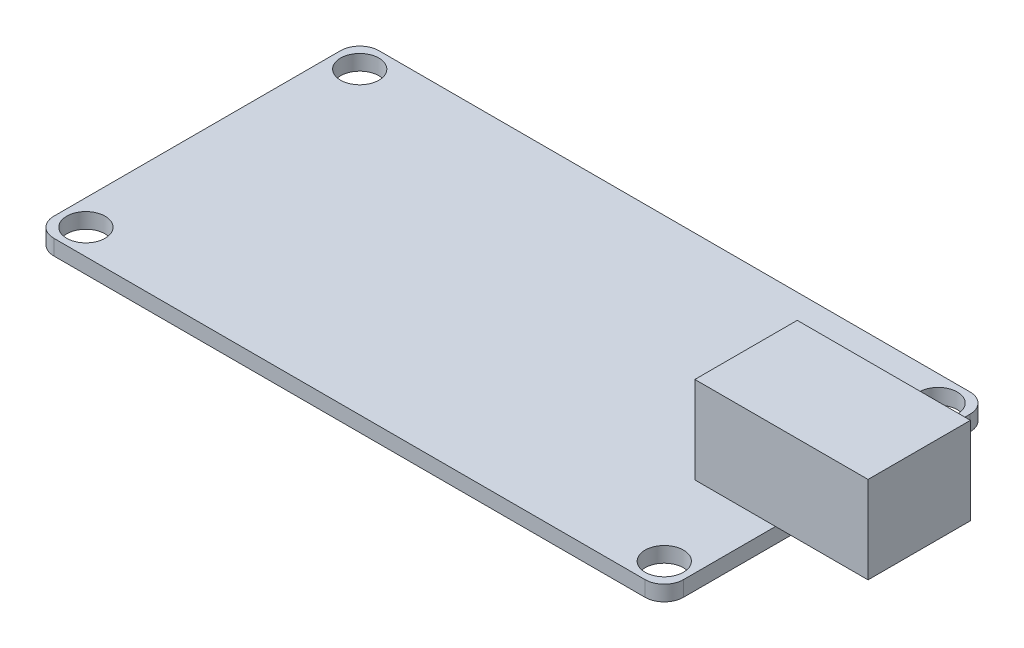
ISO-10303-21;
HEADER;
FILE_DESCRIPTION(('STEP AP214'),'2;1');
FILE_NAME('part.step','',(''),(''),'','','');
FILE_SCHEMA(('AUTOMOTIVE_DESIGN { 1 0 10303 214 1 1 1 1 }'));
ENDSEC;
DATA;
#1=APPLICATION_CONTEXT('core data for automotive mechanical design processes');
#2=APPLICATION_PROTOCOL_DEFINITION('international standard','automotive_design',2000,#1);
#3=PRODUCT_CONTEXT('',#1,'mechanical');
#4=PRODUCT('Part','Part','',(#3));
#5=PRODUCT_RELATED_PRODUCT_CATEGORY('part','',(#4));
#6=PRODUCT_DEFINITION_FORMATION('','',#4);
#7=PRODUCT_DEFINITION_CONTEXT('part definition',#1,'design');
#8=PRODUCT_DEFINITION('design','',#6,#7);
#9=PRODUCT_DEFINITION_SHAPE('','',#8);
#10=(LENGTH_UNIT() NAMED_UNIT(*) SI_UNIT(.MILLI.,.METRE.));
#11=(NAMED_UNIT(*) PLANE_ANGLE_UNIT() SI_UNIT($,.RADIAN.));
#12=(NAMED_UNIT(*) SI_UNIT($,.STERADIAN.) SOLID_ANGLE_UNIT());
#13=UNCERTAINTY_MEASURE_WITH_UNIT(LENGTH_MEASURE(1.E-05),#10,'distance_accuracy_value','');
#14=(GEOMETRIC_REPRESENTATION_CONTEXT(3) GLOBAL_UNCERTAINTY_ASSIGNED_CONTEXT((#13)) GLOBAL_UNIT_ASSIGNED_CONTEXT((#10,
#11,#12)) REPRESENTATION_CONTEXT('',''));
#15=CARTESIAN_POINT('',(0.,0.,0.));
#16=DIRECTION('',(0.,0.,1.));
#17=DIRECTION('',(1.,0.,0.));
#18=AXIS2_PLACEMENT_3D('',#15,#16,#17);
#19=CARTESIAN_POINT('',(0.,1.2,0.));
#20=DIRECTION('',(0.,-1.,0.));
#21=DIRECTION('',(0.,0.,-1.));
#22=AXIS2_PLACEMENT_3D('',#19,#20,#21);
#23=PLANE('',#22);
#24=CARTESIAN_POINT('',(-22.6,1.2,-10.7));
#25=DIRECTION('',(0.,1.,0.));
#26=DIRECTION('',(0.,0.,1.));
#27=AXIS2_PLACEMENT_3D('',#24,#25,#26);
#28=CIRCLE('',#27,1.5);
#29=CARTESIAN_POINT('',(-22.6,1.2,-9.2));
#30=VERTEX_POINT('',#29);
#31=EDGE_CURVE('E156',#30,#30,#28,.T.);
#32=ORIENTED_EDGE('',*,*,#31,.F.);
#33=EDGE_LOOP('',(#32));
#34=FACE_BOUND('',#33,.T.);
#35=CARTESIAN_POINT('',(22.6,1.2,10.7));
#36=DIRECTION('',(0.,1.,0.));
#37=DIRECTION('',(0.,0.,1.));
#38=AXIS2_PLACEMENT_3D('',#35,#36,#37);
#39=CIRCLE('',#38,1.5);
#40=CARTESIAN_POINT('',(22.6,1.2,12.2));
#41=VERTEX_POINT('',#40);
#42=EDGE_CURVE('E171',#41,#41,#39,.T.);
#43=ORIENTED_EDGE('',*,*,#42,.F.);
#44=EDGE_LOOP('',(#43));
#45=FACE_BOUND('',#44,.T.);
#46=CARTESIAN_POINT('',(22.6,1.2,-10.7));
#47=DIRECTION('',(0.,1.,0.));
#48=DIRECTION('',(0.,0.,1.));
#49=AXIS2_PLACEMENT_3D('',#46,#47,#48);
#50=CIRCLE('',#49,1.5);
#51=CARTESIAN_POINT('',(22.6,1.2,-9.2));
#52=VERTEX_POINT('',#51);
#53=EDGE_CURVE('E177',#52,#52,#50,.T.);
#54=ORIENTED_EDGE('',*,*,#53,.F.);
#55=EDGE_LOOP('',(#54));
#56=FACE_BOUND('',#55,.T.);
#57=CARTESIAN_POINT('',(-22.6,1.2,10.7));
#58=DIRECTION('',(0.,1.,0.));
#59=DIRECTION('',(0.,0.,1.));
#60=AXIS2_PLACEMENT_3D('',#57,#58,#59);
#61=CIRCLE('',#60,1.5);
#62=CARTESIAN_POINT('',(-22.6,1.2,12.2));
#63=VERTEX_POINT('',#62);
#64=EDGE_CURVE('E165',#63,#63,#61,.T.);
#65=ORIENTED_EDGE('',*,*,#64,.F.);
#66=EDGE_LOOP('',(#65));
#67=FACE_BOUND('',#66,.T.);
#68=DIRECTION('',(1.,0.,0.));
#69=VECTOR('',#68,1.);
#70=CARTESIAN_POINT('',(31.8316080107851,1.2,4.00673408903628));
#71=LINE('',#70,#69);
#72=CARTESIAN_POINT('',(18.2972512567052,1.2,4.00673408903628));
#73=VERTEX_POINT('',#72);
#74=CARTESIAN_POINT('',(24.6,1.2,4.00673408903628));
#75=VERTEX_POINT('',#74);
#76=EDGE_CURVE('E50',#73,#75,#71,.T.);
#77=ORIENTED_EDGE('',*,*,#76,.F.);
#78=DIRECTION('',(0.,0.,1.));
#79=VECTOR('',#78,1.);
#80=CARTESIAN_POINT('',(18.2972512567052,1.2,-3.99326591096372));
#81=LINE('',#80,#79);
#82=CARTESIAN_POINT('',(18.2972512567052,1.2,-3.99326591096372));
#83=VERTEX_POINT('',#82);
#84=EDGE_CURVE('E284',#83,#73,#81,.T.);
#85=ORIENTED_EDGE('',*,*,#84,.F.);
#86=DIRECTION('',(-1.,0.,0.));
#87=VECTOR('',#86,1.);
#88=CARTESIAN_POINT('',(31.8316080107851,1.2,-3.99326591096372));
#89=LINE('',#88,#87);
#90=CARTESIAN_POINT('',(24.6,1.2,-3.99326591096372));
#91=VERTEX_POINT('',#90);
#92=EDGE_CURVE('E11',#91,#83,#89,.T.);
#93=ORIENTED_EDGE('',*,*,#92,.F.);
#94=DIRECTION('',(0.,0.,-1.));
#95=VECTOR('',#94,1.);
#96=CARTESIAN_POINT('',(24.6,1.2,12.7));
#97=LINE('',#96,#95);
#98=CARTESIAN_POINT('',(24.6,1.2,-11.2));
#99=VERTEX_POINT('',#98);
#100=EDGE_CURVE('E187',#91,#99,#97,.T.);
#101=ORIENTED_EDGE('',*,*,#100,.T.);
#102=CARTESIAN_POINT('',(23.1,1.2,-11.2));
#103=DIRECTION('',(0.,-1.,0.));
#104=DIRECTION('',(0.,0.,-1.));
#105=AXIS2_PLACEMENT_3D('',#102,#103,#104);
#106=CIRCLE('',#105,1.5);
#107=CARTESIAN_POINT('',(23.1,1.2,-12.7));
#108=VERTEX_POINT('',#107);
#109=EDGE_CURVE('E233',#99,#108,#106,.F.);
#110=ORIENTED_EDGE('',*,*,#109,.T.);
#111=DIRECTION('',(-1.,0.,0.));
#112=VECTOR('',#111,1.);
#113=CARTESIAN_POINT('',(-24.6,1.2,-12.7));
#114=LINE('',#113,#112);
#115=CARTESIAN_POINT('',(-23.1,1.2,-12.7));
#116=VERTEX_POINT('',#115);
#117=EDGE_CURVE('E185',#108,#116,#114,.T.);
#118=ORIENTED_EDGE('',*,*,#117,.T.);
#119=CARTESIAN_POINT('',(-23.1,1.2,-11.2));
#120=DIRECTION('',(0.,-1.,0.));
#121=DIRECTION('',(0.,0.,-1.));
#122=AXIS2_PLACEMENT_3D('',#119,#120,#121);
#123=CIRCLE('',#122,1.5);
#124=CARTESIAN_POINT('',(-24.6,1.2,-11.2));
#125=VERTEX_POINT('',#124);
#126=EDGE_CURVE('E37',#116,#125,#123,.F.);
#127=ORIENTED_EDGE('',*,*,#126,.T.);
#128=DIRECTION('',(0.,0.,1.));
#129=VECTOR('',#128,1.);
#130=CARTESIAN_POINT('',(-24.6,1.2,12.7));
#131=LINE('',#130,#129);
#132=CARTESIAN_POINT('',(-24.6,1.2,11.2));
#133=VERTEX_POINT('',#132);
#134=EDGE_CURVE('E190',#125,#133,#131,.T.);
#135=ORIENTED_EDGE('',*,*,#134,.T.);
#136=CARTESIAN_POINT('',(-23.1,1.2,11.2));
#137=DIRECTION('',(0.,-1.,0.));
#138=DIRECTION('',(0.,0.,-1.));
#139=AXIS2_PLACEMENT_3D('',#136,#137,#138);
#140=CIRCLE('',#139,1.5);
#141=CARTESIAN_POINT('',(-23.1,1.2,12.7));
#142=VERTEX_POINT('',#141);
#143=EDGE_CURVE('E223',#133,#142,#140,.F.);
#144=ORIENTED_EDGE('',*,*,#143,.T.);
#145=DIRECTION('',(1.,0.,0.));
#146=VECTOR('',#145,1.);
#147=CARTESIAN_POINT('',(-24.6,1.2,12.7));
#148=LINE('',#147,#146);
#149=CARTESIAN_POINT('',(23.1,1.2,12.7));
#150=VERTEX_POINT('',#149);
#151=EDGE_CURVE('E192',#142,#150,#148,.T.);
#152=ORIENTED_EDGE('',*,*,#151,.T.);
#153=CARTESIAN_POINT('',(23.1,1.2,11.2));
#154=DIRECTION('',(0.,-1.,0.));
#155=DIRECTION('',(0.,0.,-1.));
#156=AXIS2_PLACEMENT_3D('',#153,#154,#155);
#157=CIRCLE('',#156,1.5);
#158=CARTESIAN_POINT('',(24.6,1.2,11.2));
#159=VERTEX_POINT('',#158);
#160=EDGE_CURVE('E212',#150,#159,#157,.F.);
#161=ORIENTED_EDGE('',*,*,#160,.T.);
#162=EDGE_CURVE('E183',#159,#75,#97,.T.);
#163=ORIENTED_EDGE('',*,*,#162,.T.);
#164=EDGE_LOOP('',(#77,#85,#93,#101,#110,#118,#127,#135,#144,#152,#161,#163));
#165=FACE_BOUND('',#164,.T.);
#166=ADVANCED_FACE('F33',(#34,#45,#56,#67,#165),#23,.F.);
#167=CARTESIAN_POINT('',(0.,0.,0.));
#168=DIRECTION('',(0.,-1.,0.));
#169=DIRECTION('',(0.,0.,-1.));
#170=AXIS2_PLACEMENT_3D('',#167,#168,#169);
#171=PLANE('',#170);
#172=CARTESIAN_POINT('',(-22.6,0.,10.7));
#173=DIRECTION('',(0.,1.,0.));
#174=DIRECTION('',(0.,0.,1.));
#175=AXIS2_PLACEMENT_3D('',#172,#173,#174);
#176=CIRCLE('',#175,1.5);
#177=CARTESIAN_POINT('',(-22.6,0.,12.2));
#178=VERTEX_POINT('',#177);
#179=EDGE_CURVE('E163',#178,#178,#176,.T.);
#180=ORIENTED_EDGE('',*,*,#179,.T.);
#181=EDGE_LOOP('',(#180));
#182=FACE_BOUND('',#181,.T.);
#183=CARTESIAN_POINT('',(22.6,0.,-10.7));
#184=DIRECTION('',(0.,1.,0.));
#185=DIRECTION('',(0.,0.,1.));
#186=AXIS2_PLACEMENT_3D('',#183,#184,#185);
#187=CIRCLE('',#186,1.5);
#188=CARTESIAN_POINT('',(22.6,0.,-9.2));
#189=VERTEX_POINT('',#188);
#190=EDGE_CURVE('E174',#189,#189,#187,.T.);
#191=ORIENTED_EDGE('',*,*,#190,.T.);
#192=EDGE_LOOP('',(#191));
#193=FACE_BOUND('',#192,.T.);
#194=DIRECTION('',(0.,0.,1.));
#195=VECTOR('',#194,1.);
#196=CARTESIAN_POINT('',(-24.6,0.,12.7));
#197=LINE('',#196,#195);
#198=CARTESIAN_POINT('',(-24.6,0.,-11.2));
#199=VERTEX_POINT('',#198);
#200=CARTESIAN_POINT('',(-24.6,0.,11.2));
#201=VERTEX_POINT('',#200);
#202=EDGE_CURVE('E200',#199,#201,#197,.T.);
#203=ORIENTED_EDGE('',*,*,#202,.F.);
#204=CARTESIAN_POINT('',(-23.1,0.,-11.2));
#205=DIRECTION('',(0.,-1.,0.));
#206=DIRECTION('',(0.,0.,-1.));
#207=AXIS2_PLACEMENT_3D('',#204,#205,#206);
#208=CIRCLE('',#207,1.5);
#209=CARTESIAN_POINT('',(-23.1,0.,-12.7));
#210=VERTEX_POINT('',#209);
#211=EDGE_CURVE('E238',#199,#210,#208,.T.);
#212=ORIENTED_EDGE('',*,*,#211,.T.);
#213=DIRECTION('',(-1.,0.,0.));
#214=VECTOR('',#213,1.);
#215=CARTESIAN_POINT('',(-24.6,0.,-12.7));
#216=LINE('',#215,#214);
#217=CARTESIAN_POINT('',(23.1,0.,-12.7));
#218=VERTEX_POINT('',#217);
#219=EDGE_CURVE('E197',#218,#210,#216,.T.);
#220=ORIENTED_EDGE('',*,*,#219,.F.);
#221=CARTESIAN_POINT('',(23.1,0.,-11.2));
#222=DIRECTION('',(0.,-1.,0.));
#223=DIRECTION('',(0.,0.,-1.));
#224=AXIS2_PLACEMENT_3D('',#221,#222,#223);
#225=CIRCLE('',#224,1.5);
#226=CARTESIAN_POINT('',(24.6,0.,-11.2));
#227=VERTEX_POINT('',#226);
#228=EDGE_CURVE('E228',#218,#227,#225,.T.);
#229=ORIENTED_EDGE('',*,*,#228,.T.);
#230=DIRECTION('',(0.,0.,-1.));
#231=VECTOR('',#230,1.);
#232=CARTESIAN_POINT('',(24.6,0.,12.7));
#233=LINE('',#232,#231);
#234=CARTESIAN_POINT('',(24.6,0.,11.2));
#235=VERTEX_POINT('',#234);
#236=EDGE_CURVE('E180',#235,#227,#233,.T.);
#237=ORIENTED_EDGE('',*,*,#236,.F.);
#238=CARTESIAN_POINT('',(23.1,0.,11.2));
#239=DIRECTION('',(0.,-1.,0.));
#240=DIRECTION('',(0.,0.,-1.));
#241=AXIS2_PLACEMENT_3D('',#238,#239,#240);
#242=CIRCLE('',#241,1.5);
#243=CARTESIAN_POINT('',(23.1,0.,12.7));
#244=VERTEX_POINT('',#243);
#245=EDGE_CURVE('E206',#235,#244,#242,.T.);
#246=ORIENTED_EDGE('',*,*,#245,.T.);
#247=DIRECTION('',(1.,0.,0.));
#248=VECTOR('',#247,1.);
#249=CARTESIAN_POINT('',(-24.6,0.,12.7));
#250=LINE('',#249,#248);
#251=CARTESIAN_POINT('',(-23.1,0.,12.7));
#252=VERTEX_POINT('',#251);
#253=EDGE_CURVE('E202',#252,#244,#250,.T.);
#254=ORIENTED_EDGE('',*,*,#253,.F.);
#255=CARTESIAN_POINT('',(-23.1,0.,11.2));
#256=DIRECTION('',(0.,-1.,0.));
#257=DIRECTION('',(0.,0.,-1.));
#258=AXIS2_PLACEMENT_3D('',#255,#256,#257);
#259=CIRCLE('',#258,1.5);
#260=EDGE_CURVE('E217',#252,#201,#259,.T.);
#261=ORIENTED_EDGE('',*,*,#260,.T.);
#262=EDGE_LOOP('',(#203,#212,#220,#229,#237,#246,#254,#261));
#263=FACE_BOUND('',#262,.T.);
#264=CARTESIAN_POINT('',(22.6,0.,10.7));
#265=DIRECTION('',(0.,1.,0.));
#266=DIRECTION('',(0.,0.,1.));
#267=AXIS2_PLACEMENT_3D('',#264,#265,#266);
#268=CIRCLE('',#267,1.5);
#269=CARTESIAN_POINT('',(22.6,0.,12.2));
#270=VERTEX_POINT('',#269);
#271=EDGE_CURVE('E168',#270,#270,#268,.T.);
#272=ORIENTED_EDGE('',*,*,#271,.T.);
#273=EDGE_LOOP('',(#272));
#274=FACE_BOUND('',#273,.T.);
#275=CARTESIAN_POINT('',(-22.6,0.,-10.7));
#276=DIRECTION('',(0.,1.,0.));
#277=DIRECTION('',(0.,0.,1.));
#278=AXIS2_PLACEMENT_3D('',#275,#276,#277);
#279=CIRCLE('',#278,1.5);
#280=CARTESIAN_POINT('',(-22.6,0.,-9.2));
#281=VERTEX_POINT('',#280);
#282=EDGE_CURVE('E153',#281,#281,#279,.T.);
#283=ORIENTED_EDGE('',*,*,#282,.T.);
#284=EDGE_LOOP('',(#283));
#285=FACE_BOUND('',#284,.T.);
#286=ADVANCED_FACE('F254',(#182,#193,#263,#274,#285),#171,.T.);
#287=CARTESIAN_POINT('',(24.6,1.2,12.7));
#288=DIRECTION('',(-1.,0.,0.));
#289=DIRECTION('',(0.,0.,1.));
#290=AXIS2_PLACEMENT_3D('',#287,#288,#289);
#291=PLANE('',#290);
#292=ORIENTED_EDGE('',*,*,#236,.T.);
#293=DIRECTION('',(0.,-1.,0.));
#294=VECTOR('',#293,1.);
#295=CARTESIAN_POINT('',(24.6,1.2,-11.2));
#296=LINE('',#295,#294);
#297=EDGE_CURVE('E230',#227,#99,#296,.F.);
#298=ORIENTED_EDGE('',*,*,#297,.T.);
#299=ORIENTED_EDGE('',*,*,#100,.F.);
#300=EDGE_CURVE('E186',#75,#91,#97,.T.);
#301=ORIENTED_EDGE('',*,*,#300,.F.);
#302=ORIENTED_EDGE('',*,*,#162,.F.);
#303=DIRECTION('',(0.,-1.,0.));
#304=VECTOR('',#303,1.);
#305=CARTESIAN_POINT('',(24.6,1.2,11.2));
#306=LINE('',#305,#304);
#307=EDGE_CURVE('E194',#159,#235,#306,.T.);
#308=ORIENTED_EDGE('',*,*,#307,.T.);
#309=EDGE_LOOP('',(#292,#298,#299,#301,#302,#308));
#310=FACE_BOUND('',#309,.T.);
#311=ADVANCED_FACE('F264',(#310),#291,.F.);
#312=CARTESIAN_POINT('',(-24.6,1.2,-12.7));
#313=DIRECTION('',(0.,0.,1.));
#314=DIRECTION('',(1.,0.,0.));
#315=AXIS2_PLACEMENT_3D('',#312,#313,#314);
#316=PLANE('',#315);
#317=ORIENTED_EDGE('',*,*,#219,.T.);
#318=DIRECTION('',(0.,-1.,0.));
#319=VECTOR('',#318,1.);
#320=CARTESIAN_POINT('',(-23.1,1.2,-12.7));
#321=LINE('',#320,#319);
#322=EDGE_CURVE('E239',#210,#116,#321,.F.);
#323=ORIENTED_EDGE('',*,*,#322,.T.);
#324=ORIENTED_EDGE('',*,*,#117,.F.);
#325=DIRECTION('',(0.,-1.,0.));
#326=VECTOR('',#325,1.);
#327=CARTESIAN_POINT('',(23.1,1.2,-12.7));
#328=LINE('',#327,#326);
#329=EDGE_CURVE('E225',#108,#218,#328,.T.);
#330=ORIENTED_EDGE('',*,*,#329,.T.);
#331=EDGE_LOOP('',(#317,#323,#324,#330));
#332=FACE_BOUND('',#331,.T.);
#333=ADVANCED_FACE('F256',(#332),#316,.F.);
#334=CARTESIAN_POINT('',(-24.6,1.2,12.7));
#335=DIRECTION('',(1.,0.,0.));
#336=DIRECTION('',(0.,0.,-1.));
#337=AXIS2_PLACEMENT_3D('',#334,#335,#336);
#338=PLANE('',#337);
#339=ORIENTED_EDGE('',*,*,#134,.F.);
#340=DIRECTION('',(0.,-1.,0.));
#341=VECTOR('',#340,1.);
#342=CARTESIAN_POINT('',(-24.6,1.2,-11.2));
#343=LINE('',#342,#341);
#344=EDGE_CURVE('E235',#125,#199,#343,.T.);
#345=ORIENTED_EDGE('',*,*,#344,.T.);
#346=ORIENTED_EDGE('',*,*,#202,.T.);
#347=DIRECTION('',(0.,-1.,0.));
#348=VECTOR('',#347,1.);
#349=CARTESIAN_POINT('',(-24.6,1.2,11.2));
#350=LINE('',#349,#348);
#351=EDGE_CURVE('E220',#201,#133,#350,.F.);
#352=ORIENTED_EDGE('',*,*,#351,.T.);
#353=EDGE_LOOP('',(#339,#345,#346,#352));
#354=FACE_BOUND('',#353,.T.);
#355=ADVANCED_FACE('F248',(#354),#338,.F.);
#356=CARTESIAN_POINT('',(-24.6,1.2,12.7));
#357=DIRECTION('',(0.,0.,-1.));
#358=DIRECTION('',(-1.,0.,0.));
#359=AXIS2_PLACEMENT_3D('',#356,#357,#358);
#360=PLANE('',#359);
#361=ORIENTED_EDGE('',*,*,#151,.F.);
#362=DIRECTION('',(0.,-1.,0.));
#363=VECTOR('',#362,1.);
#364=CARTESIAN_POINT('',(-23.1,1.2,12.7));
#365=LINE('',#364,#363);
#366=EDGE_CURVE('E214',#142,#252,#365,.T.);
#367=ORIENTED_EDGE('',*,*,#366,.T.);
#368=ORIENTED_EDGE('',*,*,#253,.T.);
#369=DIRECTION('',(0.,-1.,0.));
#370=VECTOR('',#369,1.);
#371=CARTESIAN_POINT('',(23.1,1.2,12.7));
#372=LINE('',#371,#370);
#373=EDGE_CURVE('E209',#244,#150,#372,.F.);
#374=ORIENTED_EDGE('',*,*,#373,.T.);
#375=EDGE_LOOP('',(#361,#367,#368,#374));
#376=FACE_BOUND('',#375,.T.);
#377=ADVANCED_FACE('F274',(#376),#360,.F.);
#378=CARTESIAN_POINT('',(22.6,1.2,-10.7));
#379=DIRECTION('',(0.,-1.,0.));
#380=DIRECTION('',(0.,0.,-1.));
#381=AXIS2_PLACEMENT_3D('',#378,#379,#380);
#382=CYLINDRICAL_SURFACE('',#381,1.5);
#383=ORIENTED_EDGE('',*,*,#53,.T.);
#384=EDGE_LOOP('',(#383));
#385=FACE_BOUND('',#384,.T.);
#386=ORIENTED_EDGE('',*,*,#190,.F.);
#387=EDGE_LOOP('',(#386));
#388=FACE_BOUND('',#387,.T.);
#389=ADVANCED_FACE('F318',(#385,#388),#382,.F.);
#390=CARTESIAN_POINT('',(22.6,1.2,10.7));
#391=DIRECTION('',(0.,-1.,0.));
#392=DIRECTION('',(0.,0.,-1.));
#393=AXIS2_PLACEMENT_3D('',#390,#391,#392);
#394=CYLINDRICAL_SURFACE('',#393,1.5);
#395=ORIENTED_EDGE('',*,*,#42,.T.);
#396=EDGE_LOOP('',(#395));
#397=FACE_BOUND('',#396,.T.);
#398=ORIENTED_EDGE('',*,*,#271,.F.);
#399=EDGE_LOOP('',(#398));
#400=FACE_BOUND('',#399,.T.);
#401=ADVANCED_FACE('F348',(#397,#400),#394,.F.);
#402=CARTESIAN_POINT('',(-22.6,1.2,10.7));
#403=DIRECTION('',(0.,-1.,0.));
#404=DIRECTION('',(0.,0.,-1.));
#405=AXIS2_PLACEMENT_3D('',#402,#403,#404);
#406=CYLINDRICAL_SURFACE('',#405,1.5);
#407=ORIENTED_EDGE('',*,*,#64,.T.);
#408=EDGE_LOOP('',(#407));
#409=FACE_BOUND('',#408,.T.);
#410=ORIENTED_EDGE('',*,*,#179,.F.);
#411=EDGE_LOOP('',(#410));
#412=FACE_BOUND('',#411,.T.);
#413=ADVANCED_FACE('F345',(#409,#412),#406,.F.);
#414=CARTESIAN_POINT('',(-22.6,1.2,-10.7));
#415=DIRECTION('',(0.,-1.,0.));
#416=DIRECTION('',(0.,0.,-1.));
#417=AXIS2_PLACEMENT_3D('',#414,#415,#416);
#418=CYLINDRICAL_SURFACE('',#417,1.5);
#419=ORIENTED_EDGE('',*,*,#31,.T.);
#420=EDGE_LOOP('',(#419));
#421=FACE_BOUND('',#420,.T.);
#422=ORIENTED_EDGE('',*,*,#282,.F.);
#423=EDGE_LOOP('',(#422));
#424=FACE_BOUND('',#423,.T.);
#425=ADVANCED_FACE('F330',(#421,#424),#418,.F.);
#426=CARTESIAN_POINT('',(23.1,1.2,11.2));
#427=DIRECTION('',(0.,-1.,0.));
#428=DIRECTION('',(0.,0.,-1.));
#429=AXIS2_PLACEMENT_3D('',#426,#427,#428);
#430=CYLINDRICAL_SURFACE('',#429,1.5);
#431=ORIENTED_EDGE('',*,*,#160,.F.);
#432=ORIENTED_EDGE('',*,*,#373,.F.);
#433=ORIENTED_EDGE('',*,*,#245,.F.);
#434=ORIENTED_EDGE('',*,*,#307,.F.);
#435=EDGE_LOOP('',(#431,#432,#433,#434));
#436=FACE_BOUND('',#435,.T.);
#437=ADVANCED_FACE('F269',(#436),#430,.T.);
#438=CARTESIAN_POINT('',(-23.1,1.2,11.2));
#439=DIRECTION('',(0.,-1.,0.));
#440=DIRECTION('',(0.,0.,-1.));
#441=AXIS2_PLACEMENT_3D('',#438,#439,#440);
#442=CYLINDRICAL_SURFACE('',#441,1.5);
#443=ORIENTED_EDGE('',*,*,#143,.F.);
#444=ORIENTED_EDGE('',*,*,#351,.F.);
#445=ORIENTED_EDGE('',*,*,#260,.F.);
#446=ORIENTED_EDGE('',*,*,#366,.F.);
#447=EDGE_LOOP('',(#443,#444,#445,#446));
#448=FACE_BOUND('',#447,.T.);
#449=ADVANCED_FACE('F277',(#448),#442,.T.);
#450=CARTESIAN_POINT('',(23.1,1.2,-11.2));
#451=DIRECTION('',(0.,-1.,0.));
#452=DIRECTION('',(0.,0.,-1.));
#453=AXIS2_PLACEMENT_3D('',#450,#451,#452);
#454=CYLINDRICAL_SURFACE('',#453,1.5);
#455=ORIENTED_EDGE('',*,*,#109,.F.);
#456=ORIENTED_EDGE('',*,*,#297,.F.);
#457=ORIENTED_EDGE('',*,*,#228,.F.);
#458=ORIENTED_EDGE('',*,*,#329,.F.);
#459=EDGE_LOOP('',(#455,#456,#457,#458));
#460=FACE_BOUND('',#459,.T.);
#461=ADVANCED_FACE('F260',(#460),#454,.T.);
#462=CARTESIAN_POINT('',(-23.1,1.2,-11.2));
#463=DIRECTION('',(0.,-1.,0.));
#464=DIRECTION('',(0.,0.,-1.));
#465=AXIS2_PLACEMENT_3D('',#462,#463,#464);
#466=CYLINDRICAL_SURFACE('',#465,1.5);
#467=ORIENTED_EDGE('',*,*,#126,.F.);
#468=ORIENTED_EDGE('',*,*,#322,.F.);
#469=ORIENTED_EDGE('',*,*,#211,.F.);
#470=ORIENTED_EDGE('',*,*,#344,.F.);
#471=EDGE_LOOP('',(#467,#468,#469,#470));
#472=FACE_BOUND('',#471,.T.);
#473=ADVANCED_FACE('F35',(#472),#466,.T.);
#474=CARTESIAN_POINT('',(31.8316080107851,8.,-3.99326591096372));
#475=DIRECTION('',(-1.,0.,0.));
#476=DIRECTION('',(0.,0.,1.));
#477=AXIS2_PLACEMENT_3D('',#474,#475,#476);
#478=PLANE('',#477);
#479=DIRECTION('',(0.,0.,-1.));
#480=VECTOR('',#479,1.);
#481=CARTESIAN_POINT('',(31.8316080107851,1.2,-3.99326591096372));
#482=LINE('',#481,#480);
#483=CARTESIAN_POINT('',(31.8316080107851,1.2,4.00673408903628));
#484=VERTEX_POINT('',#483);
#485=CARTESIAN_POINT('',(31.8316080107851,1.2,-3.99326591096372));
#486=VERTEX_POINT('',#485);
#487=EDGE_CURVE('E152',#484,#486,#482,.T.);
#488=ORIENTED_EDGE('',*,*,#487,.T.);
#489=DIRECTION('',(0.,-1.,0.));
#490=VECTOR('',#489,1.);
#491=CARTESIAN_POINT('',(31.8316080107851,8.,-3.99326591096372));
#492=LINE('',#491,#490);
#493=CARTESIAN_POINT('',(31.8316080107851,8.,-3.99326591096372));
#494=VERTEX_POINT('',#493);
#495=EDGE_CURVE('E133',#494,#486,#492,.T.);
#496=ORIENTED_EDGE('',*,*,#495,.F.);
#497=DIRECTION('',(0.,0.,-1.));
#498=VECTOR('',#497,1.);
#499=CARTESIAN_POINT('',(31.8316080107851,8.,-3.99326591096372));
#500=LINE('',#499,#498);
#501=CARTESIAN_POINT('',(31.8316080107851,8.,4.00673408903628));
#502=VERTEX_POINT('',#501);
#503=EDGE_CURVE('E140',#502,#494,#500,.T.);
#504=ORIENTED_EDGE('',*,*,#503,.F.);
#505=DIRECTION('',(0.,-1.,0.));
#506=VECTOR('',#505,1.);
#507=CARTESIAN_POINT('',(31.8316080107851,8.,4.00673408903628));
#508=LINE('',#507,#506);
#509=EDGE_CURVE('E291',#502,#484,#508,.T.);
#510=ORIENTED_EDGE('',*,*,#509,.T.);
#511=EDGE_LOOP('',(#488,#496,#504,#510));
#512=FACE_BOUND('',#511,.T.);
#513=ADVANCED_FACE('F150',(#512),#478,.F.);
#514=CARTESIAN_POINT('',(31.8316080107851,8.,-3.99326591096372));
#515=DIRECTION('',(0.,0.,1.));
#516=DIRECTION('',(1.,0.,0.));
#517=AXIS2_PLACEMENT_3D('',#514,#515,#516);
#518=PLANE('',#517);
#519=EDGE_CURVE('E43',#486,#91,#89,.T.);
#520=ORIENTED_EDGE('',*,*,#519,.T.);
#521=ORIENTED_EDGE('',*,*,#92,.T.);
#522=DIRECTION('',(0.,-1.,0.));
#523=VECTOR('',#522,1.);
#524=CARTESIAN_POINT('',(18.2972512567052,8.,-3.99326591096372));
#525=LINE('',#524,#523);
#526=CARTESIAN_POINT('',(18.2972512567052,8.,-3.99326591096372));
#527=VERTEX_POINT('',#526);
#528=EDGE_CURVE('E136',#527,#83,#525,.T.);
#529=ORIENTED_EDGE('',*,*,#528,.F.);
#530=DIRECTION('',(-1.,0.,0.));
#531=VECTOR('',#530,1.);
#532=CARTESIAN_POINT('',(31.8316080107851,8.,-3.99326591096372));
#533=LINE('',#532,#531);
#534=EDGE_CURVE('E128',#494,#527,#533,.T.);
#535=ORIENTED_EDGE('',*,*,#534,.F.);
#536=ORIENTED_EDGE('',*,*,#495,.T.);
#537=EDGE_LOOP('',(#520,#521,#529,#535,#536));
#538=FACE_BOUND('',#537,.T.);
#539=ADVANCED_FACE('F131',(#538),#518,.F.);
#540=CARTESIAN_POINT('',(18.2972512567052,8.,-3.99326591096372));
#541=DIRECTION('',(1.,0.,0.));
#542=DIRECTION('',(0.,0.,-1.));
#543=AXIS2_PLACEMENT_3D('',#540,#541,#542);
#544=PLANE('',#543);
#545=ORIENTED_EDGE('',*,*,#84,.T.);
#546=DIRECTION('',(0.,-1.,0.));
#547=VECTOR('',#546,1.);
#548=CARTESIAN_POINT('',(18.2972512567052,8.,4.00673408903628));
#549=LINE('',#548,#547);
#550=CARTESIAN_POINT('',(18.2972512567052,8.,4.00673408903628));
#551=VERTEX_POINT('',#550);
#552=EDGE_CURVE('E158',#551,#73,#549,.T.);
#553=ORIENTED_EDGE('',*,*,#552,.F.);
#554=DIRECTION('',(0.,0.,1.));
#555=VECTOR('',#554,1.);
#556=CARTESIAN_POINT('',(18.2972512567052,8.,-3.99326591096372));
#557=LINE('',#556,#555);
#558=EDGE_CURVE('E139',#527,#551,#557,.T.);
#559=ORIENTED_EDGE('',*,*,#558,.F.);
#560=ORIENTED_EDGE('',*,*,#528,.T.);
#561=EDGE_LOOP('',(#545,#553,#559,#560));
#562=FACE_BOUND('',#561,.T.);
#563=ADVANCED_FACE('F296',(#562),#544,.F.);
#564=CARTESIAN_POINT('',(31.8316080107851,8.,4.00673408903628));
#565=DIRECTION('',(0.,0.,-1.));
#566=DIRECTION('',(-1.,0.,0.));
#567=AXIS2_PLACEMENT_3D('',#564,#565,#566);
#568=PLANE('',#567);
#569=ORIENTED_EDGE('',*,*,#76,.T.);
#570=EDGE_CURVE('E281',#75,#484,#71,.T.);
#571=ORIENTED_EDGE('',*,*,#570,.T.);
#572=ORIENTED_EDGE('',*,*,#509,.F.);
#573=DIRECTION('',(1.,0.,0.));
#574=VECTOR('',#573,1.);
#575=CARTESIAN_POINT('',(31.8316080107851,8.,4.00673408903628));
#576=LINE('',#575,#574);
#577=EDGE_CURVE('E145',#551,#502,#576,.T.);
#578=ORIENTED_EDGE('',*,*,#577,.F.);
#579=ORIENTED_EDGE('',*,*,#552,.T.);
#580=EDGE_LOOP('',(#569,#571,#572,#578,#579));
#581=FACE_BOUND('',#580,.T.);
#582=ADVANCED_FACE('F287',(#581),#568,.F.);
#583=CARTESIAN_POINT('',(0.,8.,0.));
#584=DIRECTION('',(0.,-1.,0.));
#585=DIRECTION('',(0.,0.,-1.));
#586=AXIS2_PLACEMENT_3D('',#583,#584,#585);
#587=PLANE('',#586);
#588=ORIENTED_EDGE('',*,*,#503,.T.);
#589=ORIENTED_EDGE('',*,*,#534,.T.);
#590=ORIENTED_EDGE('',*,*,#558,.T.);
#591=ORIENTED_EDGE('',*,*,#577,.T.);
#592=EDGE_LOOP('',(#588,#589,#590,#591));
#593=FACE_BOUND('',#592,.T.);
#594=ADVANCED_FACE('F143',(#593),#587,.F.);
#595=CARTESIAN_POINT('',(0.,1.2,0.));
#596=DIRECTION('',(0.,-1.,0.));
#597=DIRECTION('',(0.,0.,-1.));
#598=AXIS2_PLACEMENT_3D('',#595,#596,#597);
#599=PLANE('',#598);
#600=ORIENTED_EDGE('',*,*,#570,.F.);
#601=ORIENTED_EDGE('',*,*,#300,.T.);
#602=ORIENTED_EDGE('',*,*,#519,.F.);
#603=ORIENTED_EDGE('',*,*,#487,.F.);
#604=EDGE_LOOP('',(#600,#601,#602,#603));
#605=FACE_BOUND('',#604,.T.);
#606=ADVANCED_FACE('F282',(#605),#599,.T.);
#607=CLOSED_SHELL('',(#166,#286,#311,#333,#355,#377,#389,#401,#413,#425,#437,#449,#461,#473,
#513,#539,#563,#582,#594,#606));
#608=MANIFOLD_SOLID_BREP('B2',#607);
#609=ADVANCED_BREP_SHAPE_REPRESENTATION('',(#18,#608),#14);
#610=SHAPE_DEFINITION_REPRESENTATION(#9,#609);
ENDSEC;
END-ISO-10303-21;
